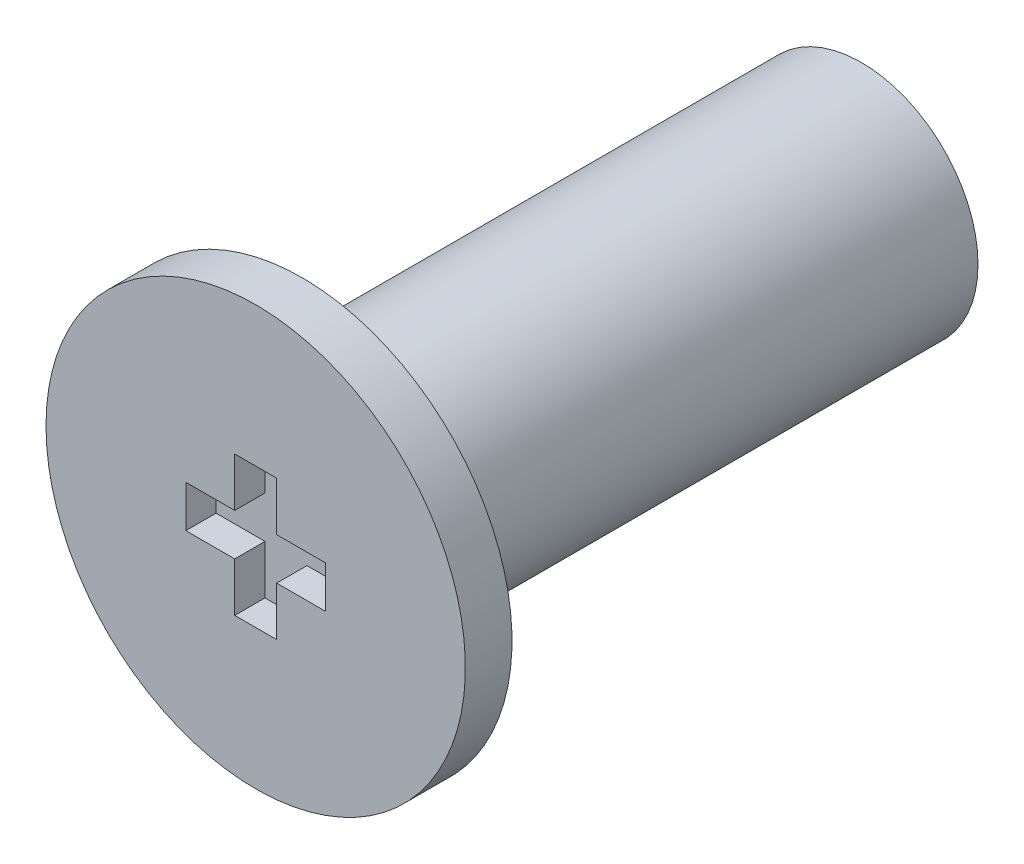
ISO-10303-21;
HEADER;
FILE_DESCRIPTION(('STEP AP214'),'2;1');
FILE_NAME('part.step','',(''),(''),'','','');
FILE_SCHEMA(('AUTOMOTIVE_DESIGN { 1 0 10303 214 1 1 1 1 }'));
ENDSEC;
DATA;
#1=APPLICATION_CONTEXT('core data for automotive mechanical design processes');
#2=APPLICATION_PROTOCOL_DEFINITION('international standard','automotive_design',2000,#1);
#3=PRODUCT_CONTEXT('',#1,'mechanical');
#4=PRODUCT('Part','Part','',(#3));
#5=PRODUCT_RELATED_PRODUCT_CATEGORY('part','',(#4));
#6=PRODUCT_DEFINITION_FORMATION('','',#4);
#7=PRODUCT_DEFINITION_CONTEXT('part definition',#1,'design');
#8=PRODUCT_DEFINITION('design','',#6,#7);
#9=PRODUCT_DEFINITION_SHAPE('','',#8);
#10=(LENGTH_UNIT() NAMED_UNIT(*) SI_UNIT(.MILLI.,.METRE.));
#11=(NAMED_UNIT(*) PLANE_ANGLE_UNIT() SI_UNIT($,.RADIAN.));
#12=(NAMED_UNIT(*) SI_UNIT($,.STERADIAN.) SOLID_ANGLE_UNIT());
#13=UNCERTAINTY_MEASURE_WITH_UNIT(LENGTH_MEASURE(1.E-05),#10,'distance_accuracy_value','');
#14=(GEOMETRIC_REPRESENTATION_CONTEXT(3) GLOBAL_UNCERTAINTY_ASSIGNED_CONTEXT((#13)) GLOBAL_UNIT_ASSIGNED_CONTEXT((#10,
#11,#12)) REPRESENTATION_CONTEXT('',''));
#15=CARTESIAN_POINT('',(0.,0.,0.));
#16=DIRECTION('',(0.,0.,1.));
#17=DIRECTION('',(1.,0.,0.));
#18=AXIS2_PLACEMENT_3D('',#15,#16,#17);
#19=CARTESIAN_POINT('',(0.,0.,-12.));
#20=DIRECTION('',(0.,0.,1.));
#21=DIRECTION('',(1.,0.,0.));
#22=AXIS2_PLACEMENT_3D('',#19,#20,#21);
#23=CYLINDRICAL_SURFACE('',#22,2.5);
#24=CARTESIAN_POINT('',(0.,0.,-12.));
#25=DIRECTION('',(0.,0.,1.));
#26=DIRECTION('',(1.,0.,0.));
#27=AXIS2_PLACEMENT_3D('',#24,#25,#26);
#28=CIRCLE('',#27,2.5);
#29=CARTESIAN_POINT('',(2.5,0.,-12.));
#30=VERTEX_POINT('',#29);
#31=EDGE_CURVE('E212',#30,#30,#28,.T.);
#32=ORIENTED_EDGE('',*,*,#31,.T.);
#33=EDGE_LOOP('',(#32));
#34=FACE_BOUND('',#33,.T.);
#35=CARTESIAN_POINT('',(0.,0.,0.));
#36=DIRECTION('',(0.,0.,1.));
#37=DIRECTION('',(1.,0.,0.));
#38=AXIS2_PLACEMENT_3D('',#35,#36,#37);
#39=CIRCLE('',#38,2.5);
#40=CARTESIAN_POINT('',(2.5,0.,0.));
#41=VERTEX_POINT('',#40);
#42=EDGE_CURVE('E208',#41,#41,#39,.T.);
#43=ORIENTED_EDGE('',*,*,#42,.F.);
#44=EDGE_LOOP('',(#43));
#45=FACE_BOUND('',#44,.T.);
#46=ADVANCED_FACE('F41',(#34,#45),#23,.T.);
#47=CARTESIAN_POINT('',(0.,0.,-12.));
#48=DIRECTION('',(0.,0.,1.));
#49=DIRECTION('',(1.,0.,0.));
#50=AXIS2_PLACEMENT_3D('',#47,#48,#49);
#51=PLANE('',#50);
#52=ORIENTED_EDGE('',*,*,#31,.F.);
#53=EDGE_LOOP('',(#52));
#54=FACE_BOUND('',#53,.T.);
#55=ADVANCED_FACE('F281',(#54),#51,.F.);
#56=CARTESIAN_POINT('',(0.,0.,0.));
#57=DIRECTION('',(0.,0.,1.));
#58=DIRECTION('',(1.,0.,0.));
#59=AXIS2_PLACEMENT_3D('',#56,#57,#58);
#60=PLANE('',#59);
#61=ORIENTED_EDGE('',*,*,#42,.T.);
#62=EDGE_LOOP('',(#61));
#63=FACE_BOUND('',#62,.T.);
#64=CARTESIAN_POINT('',(0.,0.,0.));
#65=DIRECTION('',(0.,0.,-1.));
#66=DIRECTION('',(-1.,0.,0.));
#67=AXIS2_PLACEMENT_3D('',#64,#65,#66);
#68=CIRCLE('',#67,4.5);
#69=CARTESIAN_POINT('',(-4.5,0.,0.));
#70=VERTEX_POINT('',#69);
#71=EDGE_CURVE('E210',#70,#70,#68,.T.);
#72=ORIENTED_EDGE('',*,*,#71,.T.);
#73=EDGE_LOOP('',(#72));
#74=FACE_BOUND('',#73,.T.);
#75=ADVANCED_FACE('F286',(#63,#74),#60,.F.);
#76=CARTESIAN_POINT('',(0.,0.,-2.));
#77=DIRECTION('',(0.,0.,-1.));
#78=DIRECTION('',(-1.,0.,0.));
#79=AXIS2_PLACEMENT_3D('',#76,#77,#78);
#80=CYLINDRICAL_SURFACE('',#79,4.5);
#81=ORIENTED_EDGE('',*,*,#71,.F.);
#82=EDGE_LOOP('',(#81));
#83=FACE_BOUND('',#82,.T.);
#84=CARTESIAN_POINT('',(0.,0.,1.));
#85=DIRECTION('',(0.,0.,-1.));
#86=DIRECTION('',(-1.,0.,0.));
#87=AXIS2_PLACEMENT_3D('',#84,#85,#86);
#88=CIRCLE('',#87,4.5);
#89=CARTESIAN_POINT('',(-4.5,0.,1.));
#90=VERTEX_POINT('',#89);
#91=EDGE_CURVE('E179',#90,#90,#88,.T.);
#92=ORIENTED_EDGE('',*,*,#91,.T.);
#93=EDGE_LOOP('',(#92));
#94=FACE_BOUND('',#93,.T.);
#95=ADVANCED_FACE('F300',(#83,#94),#80,.T.);
#96=CARTESIAN_POINT('',(4.5,0.,1.));
#97=DIRECTION('',(0.,0.,-1.));
#98=DIRECTION('',(-1.,0.,0.));
#99=AXIS2_PLACEMENT_3D('',#96,#97,#98);
#100=PLANE('',#99);
#101=DIRECTION('',(-1.,0.,0.));
#102=VECTOR('',#101,1.);
#103=CARTESIAN_POINT('',(4.5,-1.5,1.));
#104=LINE('',#103,#102);
#105=CARTESIAN_POINT('',(0.45,-1.5,1.));
#106=VERTEX_POINT('',#105);
#107=CARTESIAN_POINT('',(-0.45,-1.5,1.));
#108=VERTEX_POINT('',#107);
#109=EDGE_CURVE('E211',#106,#108,#104,.T.);
#110=ORIENTED_EDGE('',*,*,#109,.T.);
#111=DIRECTION('',(0.,1.,0.));
#112=VECTOR('',#111,1.);
#113=CARTESIAN_POINT('',(-0.45,0.,1.));
#114=LINE('',#113,#112);
#115=CARTESIAN_POINT('',(-0.45,-0.45,1.));
#116=VERTEX_POINT('',#115);
#117=EDGE_CURVE('E11',#108,#116,#114,.T.);
#118=ORIENTED_EDGE('',*,*,#117,.T.);
#119=DIRECTION('',(-1.,0.,0.));
#120=VECTOR('',#119,1.);
#121=CARTESIAN_POINT('',(4.5,-0.45,1.));
#122=LINE('',#121,#120);
#123=CARTESIAN_POINT('',(-1.5,-0.45,1.));
#124=VERTEX_POINT('',#123);
#125=EDGE_CURVE('E48',#116,#124,#122,.T.);
#126=ORIENTED_EDGE('',*,*,#125,.T.);
#127=DIRECTION('',(0.,1.,0.));
#128=VECTOR('',#127,1.);
#129=CARTESIAN_POINT('',(-1.5,0.,1.));
#130=LINE('',#129,#128);
#131=CARTESIAN_POINT('',(-1.5,0.45,1.));
#132=VERTEX_POINT('',#131);
#133=EDGE_CURVE('E241',#124,#132,#130,.T.);
#134=ORIENTED_EDGE('',*,*,#133,.T.);
#135=DIRECTION('',(1.,0.,0.));
#136=VECTOR('',#135,1.);
#137=CARTESIAN_POINT('',(4.5,0.45,1.));
#138=LINE('',#137,#136);
#139=CARTESIAN_POINT('',(-0.45,0.45,1.));
#140=VERTEX_POINT('',#139);
#141=EDGE_CURVE('E236',#132,#140,#138,.T.);
#142=ORIENTED_EDGE('',*,*,#141,.T.);
#143=DIRECTION('',(0.,1.,0.));
#144=VECTOR('',#143,1.);
#145=CARTESIAN_POINT('',(-0.45,0.,1.));
#146=LINE('',#145,#144);
#147=CARTESIAN_POINT('',(-0.45,1.5,1.));
#148=VERTEX_POINT('',#147);
#149=EDGE_CURVE('E237',#140,#148,#146,.T.);
#150=ORIENTED_EDGE('',*,*,#149,.T.);
#151=DIRECTION('',(1.,0.,0.));
#152=VECTOR('',#151,1.);
#153=CARTESIAN_POINT('',(4.5,1.5,1.));
#154=LINE('',#153,#152);
#155=CARTESIAN_POINT('',(0.45,1.5,1.));
#156=VERTEX_POINT('',#155);
#157=EDGE_CURVE('E231',#148,#156,#154,.T.);
#158=ORIENTED_EDGE('',*,*,#157,.T.);
#159=DIRECTION('',(0.,-1.,0.));
#160=VECTOR('',#159,1.);
#161=CARTESIAN_POINT('',(0.45,0.,1.));
#162=LINE('',#161,#160);
#163=CARTESIAN_POINT('',(0.45,0.45,1.));
#164=VERTEX_POINT('',#163);
#165=EDGE_CURVE('E228',#156,#164,#162,.T.);
#166=ORIENTED_EDGE('',*,*,#165,.T.);
#167=DIRECTION('',(1.,0.,0.));
#168=VECTOR('',#167,1.);
#169=CARTESIAN_POINT('',(4.5,0.45,1.));
#170=LINE('',#169,#168);
#171=CARTESIAN_POINT('',(1.5,0.45,1.));
#172=VERTEX_POINT('',#171);
#173=EDGE_CURVE('E229',#164,#172,#170,.T.);
#174=ORIENTED_EDGE('',*,*,#173,.T.);
#175=DIRECTION('',(0.,-1.,0.));
#176=VECTOR('',#175,1.);
#177=CARTESIAN_POINT('',(1.5,0.,1.));
#178=LINE('',#177,#176);
#179=CARTESIAN_POINT('',(1.5,-0.45,1.));
#180=VERTEX_POINT('',#179);
#181=EDGE_CURVE('E224',#172,#180,#178,.T.);
#182=ORIENTED_EDGE('',*,*,#181,.T.);
#183=DIRECTION('',(-1.,0.,0.));
#184=VECTOR('',#183,1.);
#185=CARTESIAN_POINT('',(4.5,-0.45,1.));
#186=LINE('',#185,#184);
#187=CARTESIAN_POINT('',(0.45,-0.45,1.));
#188=VERTEX_POINT('',#187);
#189=EDGE_CURVE('E222',#180,#188,#186,.T.);
#190=ORIENTED_EDGE('',*,*,#189,.T.);
#191=DIRECTION('',(0.,-1.,0.));
#192=VECTOR('',#191,1.);
#193=CARTESIAN_POINT('',(0.45,0.,1.));
#194=LINE('',#193,#192);
#195=EDGE_CURVE('E220',#188,#106,#194,.T.);
#196=ORIENTED_EDGE('',*,*,#195,.T.);
#197=EDGE_LOOP('',(#110,#118,#126,#134,#142,#150,#158,#166,#174,#182,#190,#196));
#198=FACE_BOUND('',#197,.T.);
#199=ORIENTED_EDGE('',*,*,#91,.F.);
#200=EDGE_LOOP('',(#199));
#201=FACE_BOUND('',#200,.T.);
#202=ADVANCED_FACE('F242',(#198,#201),#100,.F.);
#203=CARTESIAN_POINT('',(-0.45,-0.45,0.35));
#204=DIRECTION('',(-1.,0.,0.));
#205=DIRECTION('',(0.,0.,1.));
#206=AXIS2_PLACEMENT_3D('',#203,#204,#205);
#207=PLANE('',#206);
#208=DIRECTION('',(0.,0.,1.));
#209=VECTOR('',#208,1.);
#210=CARTESIAN_POINT('',(-0.45,-1.5,0.35));
#211=LINE('',#210,#209);
#212=CARTESIAN_POINT('',(-0.45,-1.5,0.35));
#213=VERTEX_POINT('',#212);
#214=EDGE_CURVE('E54',#213,#108,#211,.T.);
#215=ORIENTED_EDGE('',*,*,#214,.F.);
#216=DIRECTION('',(0.,-1.,0.));
#217=VECTOR('',#216,1.);
#218=CARTESIAN_POINT('',(-0.45,-0.45,0.35));
#219=LINE('',#218,#217);
#220=CARTESIAN_POINT('',(-0.45,-0.45,0.35));
#221=VERTEX_POINT('',#220);
#222=EDGE_CURVE('E129',#221,#213,#219,.T.);
#223=ORIENTED_EDGE('',*,*,#222,.F.);
#224=DIRECTION('',(0.,0.,1.));
#225=VECTOR('',#224,1.);
#226=CARTESIAN_POINT('',(-0.45,-0.45,0.35));
#227=LINE('',#226,#225);
#228=EDGE_CURVE('E171',#221,#116,#227,.T.);
#229=ORIENTED_EDGE('',*,*,#228,.T.);
#230=ORIENTED_EDGE('',*,*,#117,.F.);
#231=EDGE_LOOP('',(#215,#223,#229,#230));
#232=FACE_BOUND('',#231,.T.);
#233=ADVANCED_FACE('F127',(#232),#207,.F.);
#234=CARTESIAN_POINT('',(-1.5,-0.45,0.35));
#235=DIRECTION('',(0.,-1.,0.));
#236=DIRECTION('',(0.,0.,-1.));
#237=AXIS2_PLACEMENT_3D('',#234,#235,#236);
#238=PLANE('',#237);
#239=ORIENTED_EDGE('',*,*,#228,.F.);
#240=DIRECTION('',(1.,0.,0.));
#241=VECTOR('',#240,1.);
#242=CARTESIAN_POINT('',(-1.5,-0.45,0.35));
#243=LINE('',#242,#241);
#244=CARTESIAN_POINT('',(-1.5,-0.45,0.35));
#245=VERTEX_POINT('',#244);
#246=EDGE_CURVE('E131',#245,#221,#243,.T.);
#247=ORIENTED_EDGE('',*,*,#246,.F.);
#248=DIRECTION('',(0.,0.,1.));
#249=VECTOR('',#248,1.);
#250=CARTESIAN_POINT('',(-1.5,-0.45,0.35));
#251=LINE('',#250,#249);
#252=EDGE_CURVE('E180',#245,#124,#251,.T.);
#253=ORIENTED_EDGE('',*,*,#252,.T.);
#254=ORIENTED_EDGE('',*,*,#125,.F.);
#255=EDGE_LOOP('',(#239,#247,#253,#254));
#256=FACE_BOUND('',#255,.T.);
#257=ADVANCED_FACE('F273',(#256),#238,.F.);
#258=CARTESIAN_POINT('',(-1.5,0.45,0.35));
#259=DIRECTION('',(-1.,0.,0.));
#260=DIRECTION('',(0.,0.,1.));
#261=AXIS2_PLACEMENT_3D('',#258,#259,#260);
#262=PLANE('',#261);
#263=ORIENTED_EDGE('',*,*,#252,.F.);
#264=DIRECTION('',(0.,-1.,0.));
#265=VECTOR('',#264,1.);
#266=CARTESIAN_POINT('',(-1.5,0.45,0.35));
#267=LINE('',#266,#265);
#268=CARTESIAN_POINT('',(-1.5,0.45,0.35));
#269=VERTEX_POINT('',#268);
#270=EDGE_CURVE('E175',#269,#245,#267,.T.);
#271=ORIENTED_EDGE('',*,*,#270,.F.);
#272=DIRECTION('',(0.,0.,1.));
#273=VECTOR('',#272,1.);
#274=CARTESIAN_POINT('',(-1.5,0.45,0.35));
#275=LINE('',#274,#273);
#276=EDGE_CURVE('E178',#269,#132,#275,.T.);
#277=ORIENTED_EDGE('',*,*,#276,.T.);
#278=ORIENTED_EDGE('',*,*,#133,.F.);
#279=EDGE_LOOP('',(#263,#271,#277,#278));
#280=FACE_BOUND('',#279,.T.);
#281=ADVANCED_FACE('F275',(#280),#262,.F.);
#282=CARTESIAN_POINT('',(-0.45,0.45,0.35));
#283=DIRECTION('',(0.,1.,0.));
#284=DIRECTION('',(0.,0.,1.));
#285=AXIS2_PLACEMENT_3D('',#282,#283,#284);
#286=PLANE('',#285);
#287=ORIENTED_EDGE('',*,*,#276,.F.);
#288=DIRECTION('',(-1.,0.,0.));
#289=VECTOR('',#288,1.);
#290=CARTESIAN_POINT('',(-0.45,0.45,0.35));
#291=LINE('',#290,#289);
#292=CARTESIAN_POINT('',(-0.45,0.45,0.35));
#293=VERTEX_POINT('',#292);
#294=EDGE_CURVE('E168',#293,#269,#291,.T.);
#295=ORIENTED_EDGE('',*,*,#294,.F.);
#296=DIRECTION('',(0.,0.,1.));
#297=VECTOR('',#296,1.);
#298=CARTESIAN_POINT('',(-0.45,0.45,0.35));
#299=LINE('',#298,#297);
#300=EDGE_CURVE('E181',#293,#140,#299,.T.);
#301=ORIENTED_EDGE('',*,*,#300,.T.);
#302=ORIENTED_EDGE('',*,*,#141,.F.);
#303=EDGE_LOOP('',(#287,#295,#301,#302));
#304=FACE_BOUND('',#303,.T.);
#305=ADVANCED_FACE('F269',(#304),#286,.F.);
#306=CARTESIAN_POINT('',(-0.45,1.5,0.35));
#307=DIRECTION('',(-1.,0.,0.));
#308=DIRECTION('',(0.,0.,1.));
#309=AXIS2_PLACEMENT_3D('',#306,#307,#308);
#310=PLANE('',#309);
#311=ORIENTED_EDGE('',*,*,#300,.F.);
#312=DIRECTION('',(0.,-1.,0.));
#313=VECTOR('',#312,1.);
#314=CARTESIAN_POINT('',(-0.45,1.5,0.35));
#315=LINE('',#314,#313);
#316=CARTESIAN_POINT('',(-0.45,1.5,0.35));
#317=VERTEX_POINT('',#316);
#318=EDGE_CURVE('E169',#317,#293,#315,.T.);
#319=ORIENTED_EDGE('',*,*,#318,.F.);
#320=DIRECTION('',(0.,0.,1.));
#321=VECTOR('',#320,1.);
#322=CARTESIAN_POINT('',(-0.45,1.5,0.35));
#323=LINE('',#322,#321);
#324=EDGE_CURVE('E188',#317,#148,#323,.T.);
#325=ORIENTED_EDGE('',*,*,#324,.T.);
#326=ORIENTED_EDGE('',*,*,#149,.F.);
#327=EDGE_LOOP('',(#311,#319,#325,#326));
#328=FACE_BOUND('',#327,.T.);
#329=ADVANCED_FACE('F266',(#328),#310,.F.);
#330=CARTESIAN_POINT('',(0.45,1.5,0.35));
#331=DIRECTION('',(0.,1.,0.));
#332=DIRECTION('',(0.,0.,1.));
#333=AXIS2_PLACEMENT_3D('',#330,#331,#332);
#334=PLANE('',#333);
#335=ORIENTED_EDGE('',*,*,#324,.F.);
#336=DIRECTION('',(-1.,0.,0.));
#337=VECTOR('',#336,1.);
#338=CARTESIAN_POINT('',(0.45,1.5,0.35));
#339=LINE('',#338,#337);
#340=CARTESIAN_POINT('',(0.45,1.5,0.35));
#341=VERTEX_POINT('',#340);
#342=EDGE_CURVE('E164',#341,#317,#339,.T.);
#343=ORIENTED_EDGE('',*,*,#342,.F.);
#344=DIRECTION('',(0.,0.,1.));
#345=VECTOR('',#344,1.);
#346=CARTESIAN_POINT('',(0.45,1.5,0.35));
#347=LINE('',#346,#345);
#348=EDGE_CURVE('E189',#341,#156,#347,.T.);
#349=ORIENTED_EDGE('',*,*,#348,.T.);
#350=ORIENTED_EDGE('',*,*,#157,.F.);
#351=EDGE_LOOP('',(#335,#343,#349,#350));
#352=FACE_BOUND('',#351,.T.);
#353=ADVANCED_FACE('F261',(#352),#334,.F.);
#354=CARTESIAN_POINT('',(0.45,0.45,0.35));
#355=DIRECTION('',(1.,0.,0.));
#356=DIRECTION('',(0.,0.,-1.));
#357=AXIS2_PLACEMENT_3D('',#354,#355,#356);
#358=PLANE('',#357);
#359=ORIENTED_EDGE('',*,*,#348,.F.);
#360=DIRECTION('',(0.,1.,0.));
#361=VECTOR('',#360,1.);
#362=CARTESIAN_POINT('',(0.45,0.45,0.35));
#363=LINE('',#362,#361);
#364=CARTESIAN_POINT('',(0.45,0.45,0.35));
#365=VERTEX_POINT('',#364);
#366=EDGE_CURVE('E158',#365,#341,#363,.T.);
#367=ORIENTED_EDGE('',*,*,#366,.F.);
#368=DIRECTION('',(0.,0.,1.));
#369=VECTOR('',#368,1.);
#370=CARTESIAN_POINT('',(0.45,0.45,0.35));
#371=LINE('',#370,#369);
#372=EDGE_CURVE('E195',#365,#164,#371,.T.);
#373=ORIENTED_EDGE('',*,*,#372,.T.);
#374=ORIENTED_EDGE('',*,*,#165,.F.);
#375=EDGE_LOOP('',(#359,#367,#373,#374));
#376=FACE_BOUND('',#375,.T.);
#377=ADVANCED_FACE('F263',(#376),#358,.F.);
#378=CARTESIAN_POINT('',(1.5,0.45,0.35));
#379=DIRECTION('',(0.,1.,0.));
#380=DIRECTION('',(0.,0.,1.));
#381=AXIS2_PLACEMENT_3D('',#378,#379,#380);
#382=PLANE('',#381);
#383=ORIENTED_EDGE('',*,*,#372,.F.);
#384=DIRECTION('',(-1.,0.,0.));
#385=VECTOR('',#384,1.);
#386=CARTESIAN_POINT('',(1.5,0.45,0.35));
#387=LINE('',#386,#385);
#388=CARTESIAN_POINT('',(1.5,0.45,0.35));
#389=VERTEX_POINT('',#388);
#390=EDGE_CURVE('E160',#389,#365,#387,.T.);
#391=ORIENTED_EDGE('',*,*,#390,.F.);
#392=DIRECTION('',(0.,0.,1.));
#393=VECTOR('',#392,1.);
#394=CARTESIAN_POINT('',(1.5,0.45,0.35));
#395=LINE('',#394,#393);
#396=EDGE_CURVE('E194',#389,#172,#395,.T.);
#397=ORIENTED_EDGE('',*,*,#396,.T.);
#398=ORIENTED_EDGE('',*,*,#173,.F.);
#399=EDGE_LOOP('',(#383,#391,#397,#398));
#400=FACE_BOUND('',#399,.T.);
#401=ADVANCED_FACE('F257',(#400),#382,.F.);
#402=CARTESIAN_POINT('',(1.5,-0.45,0.35));
#403=DIRECTION('',(1.,0.,0.));
#404=DIRECTION('',(0.,0.,-1.));
#405=AXIS2_PLACEMENT_3D('',#402,#403,#404);
#406=PLANE('',#405);
#407=ORIENTED_EDGE('',*,*,#396,.F.);
#408=DIRECTION('',(0.,1.,0.));
#409=VECTOR('',#408,1.);
#410=CARTESIAN_POINT('',(1.5,-0.45,0.35));
#411=LINE('',#410,#409);
#412=CARTESIAN_POINT('',(1.5,-0.45,0.35));
#413=VERTEX_POINT('',#412);
#414=EDGE_CURVE('E151',#413,#389,#411,.T.);
#415=ORIENTED_EDGE('',*,*,#414,.F.);
#416=DIRECTION('',(0.,0.,1.));
#417=VECTOR('',#416,1.);
#418=CARTESIAN_POINT('',(1.5,-0.45,0.35));
#419=LINE('',#418,#417);
#420=EDGE_CURVE('E198',#413,#180,#419,.T.);
#421=ORIENTED_EDGE('',*,*,#420,.T.);
#422=ORIENTED_EDGE('',*,*,#181,.F.);
#423=EDGE_LOOP('',(#407,#415,#421,#422));
#424=FACE_BOUND('',#423,.T.);
#425=ADVANCED_FACE('F251',(#424),#406,.F.);
#426=CARTESIAN_POINT('',(0.45,-0.45,0.35));
#427=DIRECTION('',(0.,-1.,0.));
#428=DIRECTION('',(0.,0.,-1.));
#429=AXIS2_PLACEMENT_3D('',#426,#427,#428);
#430=PLANE('',#429);
#431=ORIENTED_EDGE('',*,*,#420,.F.);
#432=DIRECTION('',(1.,0.,0.));
#433=VECTOR('',#432,1.);
#434=CARTESIAN_POINT('',(0.45,-0.45,0.35));
#435=LINE('',#434,#433);
#436=CARTESIAN_POINT('',(0.45,-0.45,0.35));
#437=VERTEX_POINT('',#436);
#438=EDGE_CURVE('E152',#437,#413,#435,.T.);
#439=ORIENTED_EDGE('',*,*,#438,.F.);
#440=DIRECTION('',(0.,0.,1.));
#441=VECTOR('',#440,1.);
#442=CARTESIAN_POINT('',(0.45,-0.45,0.35));
#443=LINE('',#442,#441);
#444=EDGE_CURVE('E201',#437,#188,#443,.T.);
#445=ORIENTED_EDGE('',*,*,#444,.T.);
#446=ORIENTED_EDGE('',*,*,#189,.F.);
#447=EDGE_LOOP('',(#431,#439,#445,#446));
#448=FACE_BOUND('',#447,.T.);
#449=ADVANCED_FACE('F254',(#448),#430,.F.);
#450=CARTESIAN_POINT('',(0.45,-1.5,0.35));
#451=DIRECTION('',(1.,0.,0.));
#452=DIRECTION('',(0.,0.,-1.));
#453=AXIS2_PLACEMENT_3D('',#450,#451,#452);
#454=PLANE('',#453);
#455=ORIENTED_EDGE('',*,*,#444,.F.);
#456=DIRECTION('',(0.,1.,0.));
#457=VECTOR('',#456,1.);
#458=CARTESIAN_POINT('',(0.45,-1.5,0.35));
#459=LINE('',#458,#457);
#460=CARTESIAN_POINT('',(0.45,-1.5,0.35));
#461=VERTEX_POINT('',#460);
#462=EDGE_CURVE('E145',#461,#437,#459,.T.);
#463=ORIENTED_EDGE('',*,*,#462,.F.);
#464=DIRECTION('',(0.,0.,1.));
#465=VECTOR('',#464,1.);
#466=CARTESIAN_POINT('',(0.45,-1.5,0.35));
#467=LINE('',#466,#465);
#468=EDGE_CURVE('E134',#461,#106,#467,.T.);
#469=ORIENTED_EDGE('',*,*,#468,.T.);
#470=ORIENTED_EDGE('',*,*,#195,.F.);
#471=EDGE_LOOP('',(#455,#463,#469,#470));
#472=FACE_BOUND('',#471,.T.);
#473=ADVANCED_FACE('F248',(#472),#454,.F.);
#474=CARTESIAN_POINT('',(-0.45,-1.5,0.35));
#475=DIRECTION('',(0.,-1.,0.));
#476=DIRECTION('',(0.,0.,-1.));
#477=AXIS2_PLACEMENT_3D('',#474,#475,#476);
#478=PLANE('',#477);
#479=ORIENTED_EDGE('',*,*,#468,.F.);
#480=DIRECTION('',(1.,0.,0.));
#481=VECTOR('',#480,1.);
#482=CARTESIAN_POINT('',(-0.45,-1.5,0.35));
#483=LINE('',#482,#481);
#484=EDGE_CURVE('E140',#213,#461,#483,.T.);
#485=ORIENTED_EDGE('',*,*,#484,.F.);
#486=ORIENTED_EDGE('',*,*,#214,.T.);
#487=ORIENTED_EDGE('',*,*,#109,.F.);
#488=EDGE_LOOP('',(#479,#485,#486,#487));
#489=FACE_BOUND('',#488,.T.);
#490=ADVANCED_FACE('F139',(#489),#478,.F.);
#491=CARTESIAN_POINT('',(0.,0.,0.35));
#492=DIRECTION('',(0.,0.,1.));
#493=DIRECTION('',(1.,0.,0.));
#494=AXIS2_PLACEMENT_3D('',#491,#492,#493);
#495=PLANE('',#494);
#496=ORIENTED_EDGE('',*,*,#222,.T.);
#497=ORIENTED_EDGE('',*,*,#484,.T.);
#498=ORIENTED_EDGE('',*,*,#462,.T.);
#499=ORIENTED_EDGE('',*,*,#438,.T.);
#500=ORIENTED_EDGE('',*,*,#414,.T.);
#501=ORIENTED_EDGE('',*,*,#390,.T.);
#502=ORIENTED_EDGE('',*,*,#366,.T.);
#503=ORIENTED_EDGE('',*,*,#342,.T.);
#504=ORIENTED_EDGE('',*,*,#318,.T.);
#505=ORIENTED_EDGE('',*,*,#294,.T.);
#506=ORIENTED_EDGE('',*,*,#270,.T.);
#507=ORIENTED_EDGE('',*,*,#246,.T.);
#508=EDGE_LOOP('',(#496,#497,#498,#499,#500,#501,#502,#503,#504,#505,#506,#507));
#509=FACE_BOUND('',#508,.T.);
#510=ADVANCED_FACE('F142',(#509),#495,.T.);
#511=CLOSED_SHELL('',(#46,#55,#75,#95,#202,#233,#257,#281,#305,#329,#353,#377,#401,#425,#449,
#473,#490,#510));
#512=MANIFOLD_SOLID_BREP('B2',#511);
#513=ADVANCED_BREP_SHAPE_REPRESENTATION('',(#18,#512),#14);
#514=SHAPE_DEFINITION_REPRESENTATION(#9,#513);
ENDSEC;
END-ISO-10303-21;
